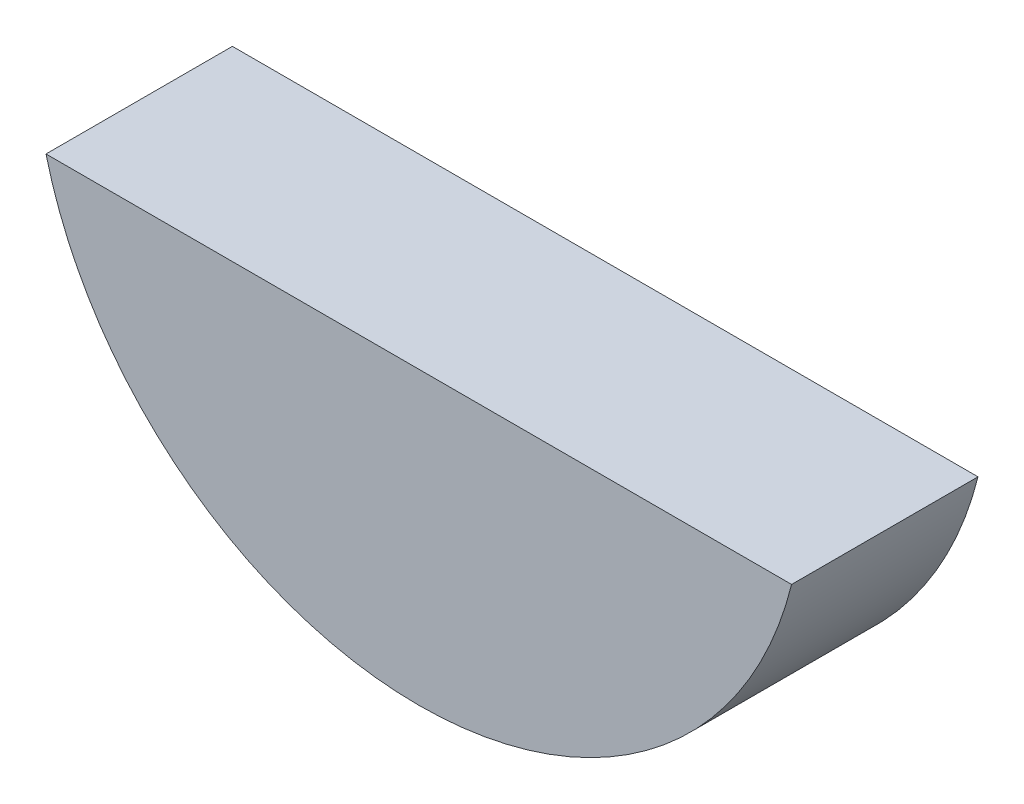
ISO-10303-21;
HEADER;
FILE_DESCRIPTION(('STEP AP214'),'2;1');
FILE_NAME('part.step','',(''),(''),'','','');
FILE_SCHEMA(('AUTOMOTIVE_DESIGN { 1 0 10303 214 1 1 1 1 }'));
ENDSEC;
DATA;
#1=APPLICATION_CONTEXT('core data for automotive mechanical design processes');
#2=APPLICATION_PROTOCOL_DEFINITION('international standard','automotive_design',2000,#1);
#3=PRODUCT_CONTEXT('',#1,'mechanical');
#4=PRODUCT('Part','Part','',(#3));
#5=PRODUCT_RELATED_PRODUCT_CATEGORY('part','',(#4));
#6=PRODUCT_DEFINITION_FORMATION('','',#4);
#7=PRODUCT_DEFINITION_CONTEXT('part definition',#1,'design');
#8=PRODUCT_DEFINITION('design','',#6,#7);
#9=PRODUCT_DEFINITION_SHAPE('','',#8);
#10=(LENGTH_UNIT() NAMED_UNIT(*) SI_UNIT(.MILLI.,.METRE.));
#11=(NAMED_UNIT(*) PLANE_ANGLE_UNIT() SI_UNIT($,.RADIAN.));
#12=(NAMED_UNIT(*) SI_UNIT($,.STERADIAN.) SOLID_ANGLE_UNIT());
#13=UNCERTAINTY_MEASURE_WITH_UNIT(LENGTH_MEASURE(1.E-05),#10,'distance_accuracy_value','');
#14=(GEOMETRIC_REPRESENTATION_CONTEXT(3) GLOBAL_UNCERTAINTY_ASSIGNED_CONTEXT((#13)) GLOBAL_UNIT_ASSIGNED_CONTEXT((#10,
#11,#12)) REPRESENTATION_CONTEXT('',''));
#15=CARTESIAN_POINT('',(0.,0.,0.));
#16=DIRECTION('',(0.,0.,1.));
#17=DIRECTION('',(1.,0.,0.));
#18=AXIS2_PLACEMENT_3D('',#15,#16,#17);
#19=CARTESIAN_POINT('',(0.,0.999999999999999,1.));
#20=DIRECTION('',(0.,0.,-1.));
#21=DIRECTION('',(-1.,0.,0.));
#22=AXIS2_PLACEMENT_3D('',#19,#20,#21);
#23=CYLINDRICAL_SURFACE('',#22,4.12310562561766);
#24=CARTESIAN_POINT('',(0.,0.999999999999999,-1.));
#25=DIRECTION('',(0.,0.,1.));
#26=DIRECTION('',(1.,0.,0.));
#27=AXIS2_PLACEMENT_3D('',#24,#25,#26);
#28=CIRCLE('',#27,4.12310562561766);
#29=CARTESIAN_POINT('',(-4.,0.,-1.));
#30=VERTEX_POINT('',#29);
#31=CARTESIAN_POINT('',(4.,0.,-1.));
#32=VERTEX_POINT('',#31);
#33=EDGE_CURVE('E70',#30,#32,#28,.T.);
#34=ORIENTED_EDGE('',*,*,#33,.T.);
#35=DIRECTION('',(0.,0.,-1.));
#36=VECTOR('',#35,1.);
#37=CARTESIAN_POINT('',(4.,0.,1.));
#38=LINE('',#37,#36);
#39=CARTESIAN_POINT('',(4.,0.,1.));
#40=VERTEX_POINT('',#39);
#41=EDGE_CURVE('E11',#40,#32,#38,.T.);
#42=ORIENTED_EDGE('',*,*,#41,.F.);
#43=CARTESIAN_POINT('',(0.,0.999999999999999,1.));
#44=DIRECTION('',(0.,0.,1.));
#45=DIRECTION('',(1.,0.,0.));
#46=AXIS2_PLACEMENT_3D('',#43,#44,#45);
#47=CIRCLE('',#46,4.12310562561766);
#48=CARTESIAN_POINT('',(-4.,0.,1.));
#49=VERTEX_POINT('',#48);
#50=EDGE_CURVE('E69',#49,#40,#47,.T.);
#51=ORIENTED_EDGE('',*,*,#50,.F.);
#52=DIRECTION('',(0.,0.,-1.));
#53=VECTOR('',#52,1.);
#54=CARTESIAN_POINT('',(-4.,0.,1.));
#55=LINE('',#54,#53);
#56=EDGE_CURVE('E47',#49,#30,#55,.T.);
#57=ORIENTED_EDGE('',*,*,#56,.T.);
#58=EDGE_LOOP('',(#34,#42,#51,#57));
#59=FACE_BOUND('',#58,.T.);
#60=ADVANCED_FACE('F39',(#59),#23,.T.);
#61=CARTESIAN_POINT('',(-4.,0.,1.));
#62=DIRECTION('',(0.,-1.,0.));
#63=DIRECTION('',(0.,0.,-1.));
#64=AXIS2_PLACEMENT_3D('',#61,#62,#63);
#65=PLANE('',#64);
#66=DIRECTION('',(-1.,0.,0.));
#67=VECTOR('',#66,1.);
#68=CARTESIAN_POINT('',(-4.,0.,-1.));
#69=LINE('',#68,#67);
#70=EDGE_CURVE('E62',#32,#30,#69,.T.);
#71=ORIENTED_EDGE('',*,*,#70,.T.);
#72=ORIENTED_EDGE('',*,*,#56,.F.);
#73=DIRECTION('',(-1.,0.,0.));
#74=VECTOR('',#73,1.);
#75=CARTESIAN_POINT('',(-4.,0.,1.));
#76=LINE('',#75,#74);
#77=EDGE_CURVE('E54',#40,#49,#76,.T.);
#78=ORIENTED_EDGE('',*,*,#77,.F.);
#79=ORIENTED_EDGE('',*,*,#41,.T.);
#80=EDGE_LOOP('',(#71,#72,#78,#79));
#81=FACE_BOUND('',#80,.T.);
#82=ADVANCED_FACE('F65',(#81),#65,.F.);
#83=CARTESIAN_POINT('',(0.,0.999999999999999,1.));
#84=DIRECTION('',(0.,0.,1.));
#85=DIRECTION('',(1.,0.,0.));
#86=AXIS2_PLACEMENT_3D('',#83,#84,#85);
#87=PLANE('',#86);
#88=ORIENTED_EDGE('',*,*,#50,.T.);
#89=ORIENTED_EDGE('',*,*,#77,.T.);
#90=EDGE_LOOP('',(#88,#89));
#91=FACE_BOUND('',#90,.T.);
#92=ADVANCED_FACE('F77',(#91),#87,.T.);
#93=CARTESIAN_POINT('',(0.,0.999999999999999,-1.));
#94=DIRECTION('',(0.,0.,1.));
#95=DIRECTION('',(1.,0.,0.));
#96=AXIS2_PLACEMENT_3D('',#93,#94,#95);
#97=PLANE('',#96);
#98=ORIENTED_EDGE('',*,*,#33,.F.);
#99=ORIENTED_EDGE('',*,*,#70,.F.);
#100=EDGE_LOOP('',(#98,#99));
#101=FACE_BOUND('',#100,.T.);
#102=ADVANCED_FACE('F73',(#101),#97,.F.);
#103=CLOSED_SHELL('',(#60,#82,#92,#102));
#104=MANIFOLD_SOLID_BREP('B2',#103);
#105=ADVANCED_BREP_SHAPE_REPRESENTATION('',(#18,#104),#14);
#106=SHAPE_DEFINITION_REPRESENTATION(#9,#105);
ENDSEC;
END-ISO-10303-21;
